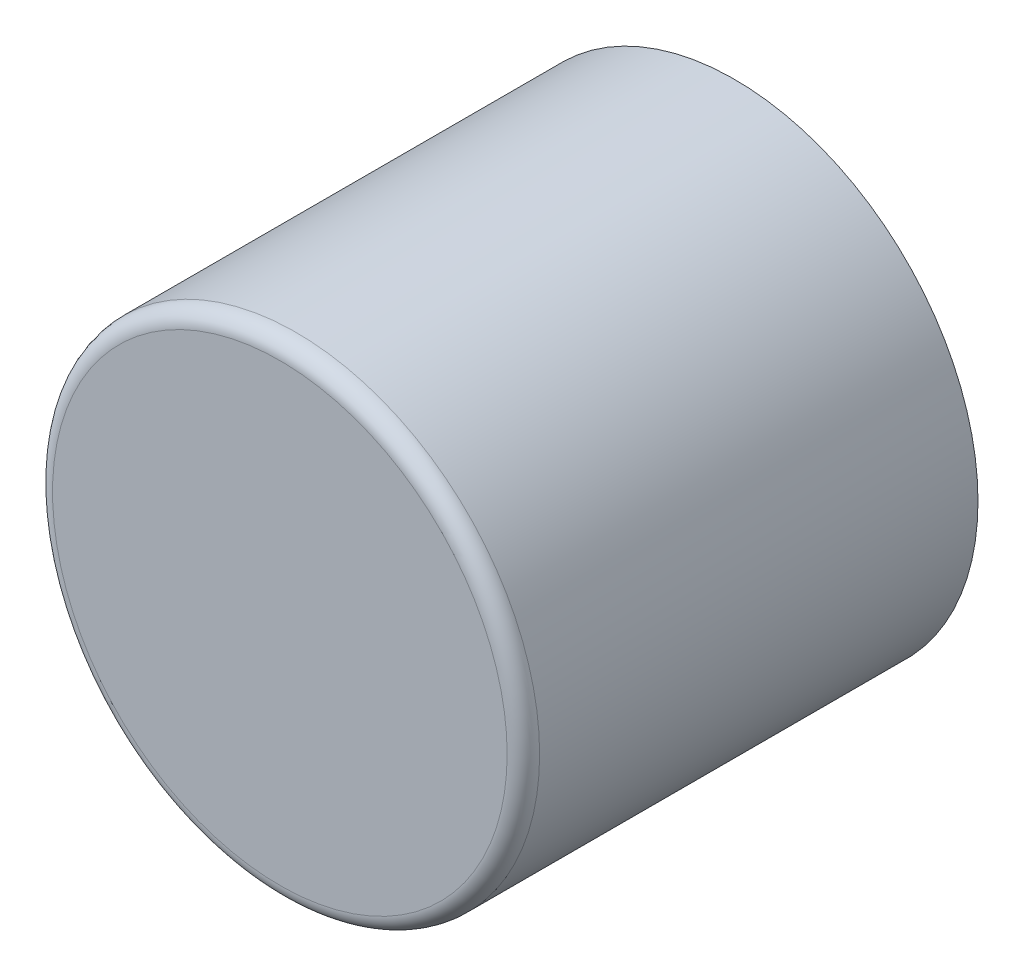
ISO-10303-21;
HEADER;
FILE_DESCRIPTION(('STEP AP214'),'2;1');
FILE_NAME('part.step','',(''),(''),'','','');
FILE_SCHEMA(('AUTOMOTIVE_DESIGN { 1 0 10303 214 1 1 1 1 }'));
ENDSEC;
DATA;
#1=APPLICATION_CONTEXT('core data for automotive mechanical design processes');
#2=APPLICATION_PROTOCOL_DEFINITION('international standard','automotive_design',2000,#1);
#3=PRODUCT_CONTEXT('',#1,'mechanical');
#4=PRODUCT('Part','Part','',(#3));
#5=PRODUCT_RELATED_PRODUCT_CATEGORY('part','',(#4));
#6=PRODUCT_DEFINITION_FORMATION('','',#4);
#7=PRODUCT_DEFINITION_CONTEXT('part definition',#1,'design');
#8=PRODUCT_DEFINITION('design','',#6,#7);
#9=PRODUCT_DEFINITION_SHAPE('','',#8);
#10=(LENGTH_UNIT() NAMED_UNIT(*) SI_UNIT(.MILLI.,.METRE.));
#11=(NAMED_UNIT(*) PLANE_ANGLE_UNIT() SI_UNIT($,.RADIAN.));
#12=(NAMED_UNIT(*) SI_UNIT($,.STERADIAN.) SOLID_ANGLE_UNIT());
#13=UNCERTAINTY_MEASURE_WITH_UNIT(LENGTH_MEASURE(1.E-05),#10,'distance_accuracy_value','');
#14=(GEOMETRIC_REPRESENTATION_CONTEXT(3) GLOBAL_UNCERTAINTY_ASSIGNED_CONTEXT((#13)) GLOBAL_UNIT_ASSIGNED_CONTEXT((#10,
#11,#12)) REPRESENTATION_CONTEXT('',''));
#15=CARTESIAN_POINT('',(0.,0.,0.));
#16=DIRECTION('',(0.,0.,1.));
#17=DIRECTION('',(1.,0.,0.));
#18=AXIS2_PLACEMENT_3D('',#15,#16,#17);
#19=CARTESIAN_POINT('',(0.,0.,14.));
#20=DIRECTION('',(0.,0.,-1.));
#21=DIRECTION('',(-1.,0.,0.));
#22=AXIS2_PLACEMENT_3D('',#19,#20,#21);
#23=CYLINDRICAL_SURFACE('',#22,7.5);
#24=CARTESIAN_POINT('',(0.,0.,13.5));
#25=DIRECTION('',(0.,0.,1.));
#26=DIRECTION('',(1.,0.,0.));
#27=AXIS2_PLACEMENT_3D('',#24,#25,#26);
#28=CIRCLE('',#27,7.5);
#29=CARTESIAN_POINT('',(7.5,0.,13.5));
#30=VERTEX_POINT('',#29);
#31=EDGE_CURVE('E11',#30,#30,#28,.F.);
#32=ORIENTED_EDGE('',*,*,#31,.T.);
#33=EDGE_LOOP('',(#32));
#34=FACE_BOUND('',#33,.T.);
#35=CARTESIAN_POINT('',(0.,0.,0.));
#36=DIRECTION('',(0.,0.,1.));
#37=DIRECTION('',(1.,0.,0.));
#38=AXIS2_PLACEMENT_3D('',#35,#36,#37);
#39=CIRCLE('',#38,7.5);
#40=CARTESIAN_POINT('',(7.5,0.,0.));
#41=VERTEX_POINT('',#40);
#42=EDGE_CURVE('E69',#41,#41,#39,.T.);
#43=ORIENTED_EDGE('',*,*,#42,.T.);
#44=EDGE_LOOP('',(#43));
#45=FACE_BOUND('',#44,.T.);
#46=ADVANCED_FACE('F47',(#34,#45),#23,.T.);
#47=CARTESIAN_POINT('',(0.,0.,14.));
#48=DIRECTION('',(0.,0.,1.));
#49=DIRECTION('',(1.,0.,0.));
#50=AXIS2_PLACEMENT_3D('',#47,#48,#49);
#51=PLANE('',#50);
#52=CARTESIAN_POINT('',(0.,0.,14.));
#53=DIRECTION('',(0.,0.,1.));
#54=DIRECTION('',(1.,0.,0.));
#55=AXIS2_PLACEMENT_3D('',#52,#53,#54);
#56=CIRCLE('',#55,7.);
#57=CARTESIAN_POINT('',(7.,0.,14.));
#58=VERTEX_POINT('',#57);
#59=EDGE_CURVE('E55',#58,#58,#56,.T.);
#60=ORIENTED_EDGE('',*,*,#59,.T.);
#61=EDGE_LOOP('',(#60));
#62=FACE_BOUND('',#61,.T.);
#63=ADVANCED_FACE('F82',(#62),#51,.T.);
#64=CARTESIAN_POINT('',(0.,0.,0.));
#65=DIRECTION('',(0.,0.,1.));
#66=DIRECTION('',(1.,0.,0.));
#67=AXIS2_PLACEMENT_3D('',#64,#65,#66);
#68=PLANE('',#67);
#69=CARTESIAN_POINT('',(0.,0.,0.));
#70=DIRECTION('',(0.,0.,-1.));
#71=DIRECTION('',(-1.,0.,0.));
#72=AXIS2_PLACEMENT_3D('',#69,#70,#71);
#73=CIRCLE('',#72,3.5);
#74=CARTESIAN_POINT('',(-3.5,0.,0.));
#75=VERTEX_POINT('',#74);
#76=EDGE_CURVE('E70',#75,#75,#73,.T.);
#77=ORIENTED_EDGE('',*,*,#76,.F.);
#78=EDGE_LOOP('',(#77));
#79=FACE_BOUND('',#78,.T.);
#80=ORIENTED_EDGE('',*,*,#42,.F.);
#81=EDGE_LOOP('',(#80));
#82=FACE_BOUND('',#81,.T.);
#83=ADVANCED_FACE('F62',(#79,#82),#68,.F.);
#84=CARTESIAN_POINT('',(0.,0.,10.));
#85=DIRECTION('',(0.,0.,-1.));
#86=DIRECTION('',(-1.,0.,0.));
#87=AXIS2_PLACEMENT_3D('',#84,#85,#86);
#88=CONICAL_SURFACE('',#87,3.5,1.0471975511966);
#89=CARTESIAN_POINT('',(0.,0.,12.0207259421637));
#90=VERTEX_POINT('',#89);
#91=VERTEX_LOOP('',#90);
#92=FACE_BOUND('',#91,.T.);
#93=CARTESIAN_POINT('',(0.,0.,10.));
#94=DIRECTION('',(0.,0.,-1.));
#95=DIRECTION('',(-1.,0.,0.));
#96=AXIS2_PLACEMENT_3D('',#93,#94,#95);
#97=CIRCLE('',#96,3.5);
#98=CARTESIAN_POINT('',(-3.5,0.,10.));
#99=VERTEX_POINT('',#98);
#100=EDGE_CURVE('E66',#99,#99,#97,.T.);
#101=ORIENTED_EDGE('',*,*,#100,.T.);
#102=EDGE_LOOP('',(#101));
#103=FACE_BOUND('',#102,.T.);
#104=ADVANCED_FACE('F58',(#92,#103),#88,.F.);
#105=CARTESIAN_POINT('',(0.,0.,0.));
#106=DIRECTION('',(0.,0.,-1.));
#107=DIRECTION('',(-1.,0.,0.));
#108=AXIS2_PLACEMENT_3D('',#105,#106,#107);
#109=CYLINDRICAL_SURFACE('',#108,3.5);
#110=ORIENTED_EDGE('',*,*,#100,.F.);
#111=EDGE_LOOP('',(#110));
#112=FACE_BOUND('',#111,.T.);
#113=ORIENTED_EDGE('',*,*,#76,.T.);
#114=EDGE_LOOP('',(#113));
#115=FACE_BOUND('',#114,.T.);
#116=ADVANCED_FACE('F61',(#112,#115),#109,.F.);
#117=CARTESIAN_POINT('',(0.,0.,13.5));
#118=DIRECTION('',(0.,0.,1.));
#119=DIRECTION('',(1.,0.,0.));
#120=AXIS2_PLACEMENT_3D('',#117,#118,#119);
#121=TOROIDAL_SURFACE('',#120,7.,0.5);
#122=ORIENTED_EDGE('',*,*,#31,.F.);
#123=EDGE_LOOP('',(#122));
#124=FACE_BOUND('',#123,.T.);
#125=ORIENTED_EDGE('',*,*,#59,.F.);
#126=EDGE_LOOP('',(#125));
#127=FACE_BOUND('',#126,.T.);
#128=ADVANCED_FACE('F49',(#124,#127),#121,.T.);
#129=CLOSED_SHELL('',(#46,#63,#83,#104,#116,#128));
#130=MANIFOLD_SOLID_BREP('B2',#129);
#131=ADVANCED_BREP_SHAPE_REPRESENTATION('',(#18,#130),#14);
#132=SHAPE_DEFINITION_REPRESENTATION(#9,#131);
ENDSEC;
END-ISO-10303-21;
